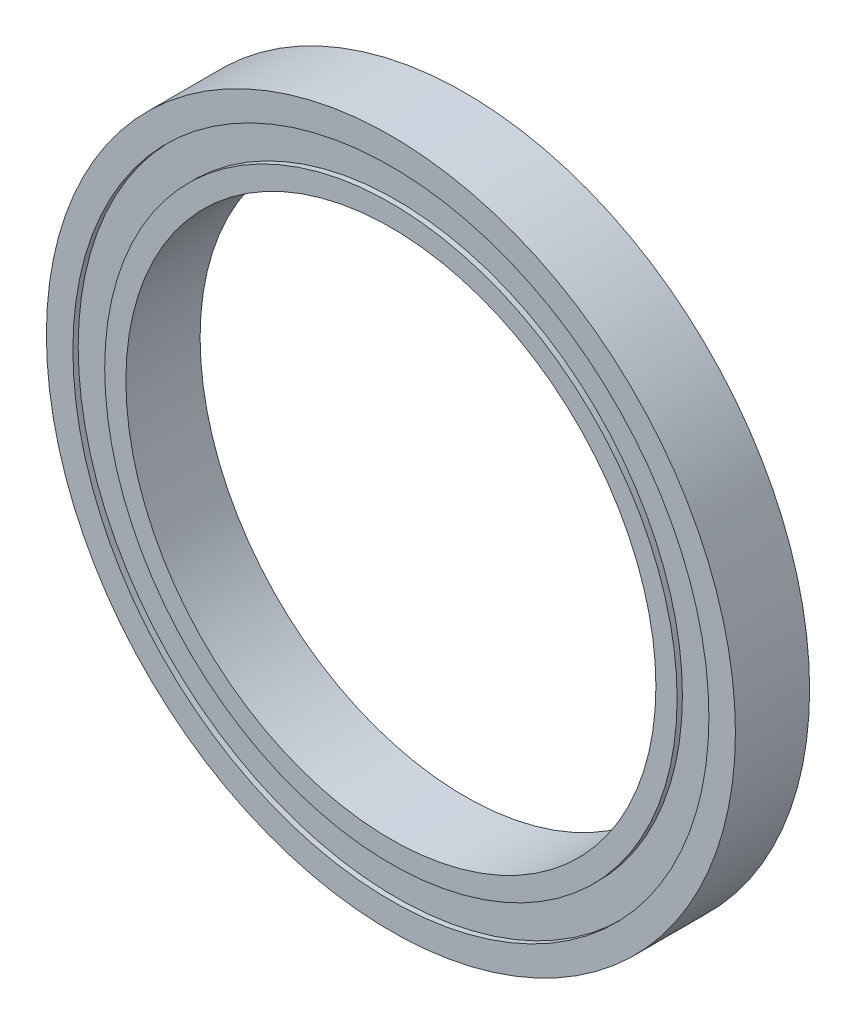
ISO-10303-21;
HEADER;
FILE_DESCRIPTION(('STEP AP214'),'2;1');
FILE_NAME('part.step','',(''),(''),'','','');
FILE_SCHEMA(('AUTOMOTIVE_DESIGN { 1 0 10303 214 1 1 1 1 }'));
ENDSEC;
DATA;
#1=APPLICATION_CONTEXT('core data for automotive mechanical design processes');
#2=APPLICATION_PROTOCOL_DEFINITION('international standard','automotive_design',2000,#1);
#3=PRODUCT_CONTEXT('',#1,'mechanical');
#4=PRODUCT('Part','Part','',(#3));
#5=PRODUCT_RELATED_PRODUCT_CATEGORY('part','',(#4));
#6=PRODUCT_DEFINITION_FORMATION('','',#4);
#7=PRODUCT_DEFINITION_CONTEXT('part definition',#1,'design');
#8=PRODUCT_DEFINITION('design','',#6,#7);
#9=PRODUCT_DEFINITION_SHAPE('','',#8);
#10=(LENGTH_UNIT() NAMED_UNIT(*) SI_UNIT(.MILLI.,.METRE.));
#11=(NAMED_UNIT(*) PLANE_ANGLE_UNIT() SI_UNIT($,.RADIAN.));
#12=(NAMED_UNIT(*) SI_UNIT($,.STERADIAN.) SOLID_ANGLE_UNIT());
#13=UNCERTAINTY_MEASURE_WITH_UNIT(LENGTH_MEASURE(1.E-05),#10,'distance_accuracy_value','');
#14=(GEOMETRIC_REPRESENTATION_CONTEXT(3) GLOBAL_UNCERTAINTY_ASSIGNED_CONTEXT((#13)) GLOBAL_UNIT_ASSIGNED_CONTEXT((#10,
#11,#12)) REPRESENTATION_CONTEXT('',''));
#15=CARTESIAN_POINT('',(0.,0.,0.));
#16=DIRECTION('',(0.,0.,1.));
#17=DIRECTION('',(1.,0.,0.));
#18=AXIS2_PLACEMENT_3D('',#15,#16,#17);
#19=CARTESIAN_POINT('',(0.,0.,-3.5));
#20=DIRECTION('',(0.,0.,1.));
#21=DIRECTION('',(1.,0.,0.));
#22=AXIS2_PLACEMENT_3D('',#19,#20,#21);
#23=PLANE('',#22);
#24=CARTESIAN_POINT('',(0.,0.,-3.5));
#25=DIRECTION('',(0.,0.,1.));
#26=DIRECTION('',(1.,0.,0.));
#27=AXIS2_PLACEMENT_3D('',#24,#25,#26);
#28=CIRCLE('',#27,25.);
#29=CARTESIAN_POINT('',(25.,0.,-3.5));
#30=VERTEX_POINT('',#29);
#31=EDGE_CURVE('E55',#30,#30,#28,.T.);
#32=ORIENTED_EDGE('',*,*,#31,.T.);
#33=EDGE_LOOP('',(#32));
#34=FACE_BOUND('',#33,.T.);
#35=CARTESIAN_POINT('',(0.,0.,-3.5));
#36=DIRECTION('',(0.,0.,1.));
#37=DIRECTION('',(1.,0.,0.));
#38=AXIS2_PLACEMENT_3D('',#35,#36,#37);
#39=CIRCLE('',#38,27.);
#40=CARTESIAN_POINT('',(27.,0.,-3.5));
#41=VERTEX_POINT('',#40);
#42=EDGE_CURVE('E78',#41,#41,#39,.T.);
#43=ORIENTED_EDGE('',*,*,#42,.F.);
#44=EDGE_LOOP('',(#43));
#45=FACE_BOUND('',#44,.T.);
#46=ADVANCED_FACE('F39',(#34,#45),#23,.F.);
#47=CARTESIAN_POINT('',(0.,0.,3.5));
#48=DIRECTION('',(0.,0.,1.));
#49=DIRECTION('',(1.,0.,0.));
#50=AXIS2_PLACEMENT_3D('',#47,#48,#49);
#51=PLANE('',#50);
#52=CARTESIAN_POINT('',(0.,0.,3.5));
#53=DIRECTION('',(0.,0.,1.));
#54=DIRECTION('',(1.,0.,0.));
#55=AXIS2_PLACEMENT_3D('',#52,#53,#54);
#56=CIRCLE('',#55,25.);
#57=CARTESIAN_POINT('',(25.,0.,3.5));
#58=VERTEX_POINT('',#57);
#59=EDGE_CURVE('E49',#58,#58,#56,.T.);
#60=ORIENTED_EDGE('',*,*,#59,.F.);
#61=EDGE_LOOP('',(#60));
#62=FACE_BOUND('',#61,.T.);
#63=CARTESIAN_POINT('',(0.,0.,3.5));
#64=DIRECTION('',(0.,0.,1.));
#65=DIRECTION('',(1.,0.,0.));
#66=AXIS2_PLACEMENT_3D('',#63,#64,#65);
#67=CIRCLE('',#66,27.);
#68=CARTESIAN_POINT('',(27.,0.,3.5));
#69=VERTEX_POINT('',#68);
#70=EDGE_CURVE('E64',#69,#69,#67,.T.);
#71=ORIENTED_EDGE('',*,*,#70,.T.);
#72=EDGE_LOOP('',(#71));
#73=FACE_BOUND('',#72,.T.);
#74=ADVANCED_FACE('F95',(#62,#73),#51,.T.);
#75=CARTESIAN_POINT('',(0.,0.,3.5));
#76=DIRECTION('',(0.,0.,1.));
#77=DIRECTION('',(1.,0.,0.));
#78=AXIS2_PLACEMENT_3D('',#75,#76,#77);
#79=CIRCLE('',#78,30.);
#80=CARTESIAN_POINT('',(30.,0.,3.5));
#81=VERTEX_POINT('',#80);
#82=EDGE_CURVE('E59',#81,#81,#79,.T.);
#83=ORIENTED_EDGE('',*,*,#82,.F.);
#84=EDGE_LOOP('',(#83));
#85=FACE_BOUND('',#84,.T.);
#86=CARTESIAN_POINT('',(0.,0.,3.5));
#87=DIRECTION('',(0.,0.,1.));
#88=DIRECTION('',(1.,0.,0.));
#89=AXIS2_PLACEMENT_3D('',#86,#87,#88);
#90=CIRCLE('',#89,32.5);
#91=CARTESIAN_POINT('',(32.5,0.,3.5));
#92=VERTEX_POINT('',#91);
#93=EDGE_CURVE('E10',#92,#92,#90,.T.);
#94=ORIENTED_EDGE('',*,*,#93,.T.);
#95=EDGE_LOOP('',(#94));
#96=FACE_BOUND('',#95,.T.);
#97=ADVANCED_FACE('F99',(#85,#96),#51,.T.);
#98=CARTESIAN_POINT('',(0.,0.,-3.5));
#99=DIRECTION('',(0.,0.,1.));
#100=DIRECTION('',(1.,0.,0.));
#101=AXIS2_PLACEMENT_3D('',#98,#99,#100);
#102=CIRCLE('',#101,30.);
#103=CARTESIAN_POINT('',(30.,0.,-3.5));
#104=VERTEX_POINT('',#103);
#105=EDGE_CURVE('E70',#104,#104,#102,.T.);
#106=ORIENTED_EDGE('',*,*,#105,.T.);
#107=EDGE_LOOP('',(#106));
#108=FACE_BOUND('',#107,.T.);
#109=CARTESIAN_POINT('',(0.,0.,-3.5));
#110=DIRECTION('',(0.,0.,1.));
#111=DIRECTION('',(1.,0.,0.));
#112=AXIS2_PLACEMENT_3D('',#109,#110,#111);
#113=CIRCLE('',#112,32.5);
#114=CARTESIAN_POINT('',(32.5,0.,-3.5));
#115=VERTEX_POINT('',#114);
#116=EDGE_CURVE('E43',#115,#115,#113,.T.);
#117=ORIENTED_EDGE('',*,*,#116,.F.);
#118=EDGE_LOOP('',(#117));
#119=FACE_BOUND('',#118,.T.);
#120=ADVANCED_FACE('F94',(#108,#119),#23,.F.);
#121=CARTESIAN_POINT('',(0.,0.,3.5));
#122=DIRECTION('',(0.,0.,-1.));
#123=DIRECTION('',(-1.,0.,0.));
#124=AXIS2_PLACEMENT_3D('',#121,#122,#123);
#125=CYLINDRICAL_SURFACE('',#124,32.5);
#126=ORIENTED_EDGE('',*,*,#93,.F.);
#127=EDGE_LOOP('',(#126));
#128=FACE_BOUND('',#127,.T.);
#129=ORIENTED_EDGE('',*,*,#116,.T.);
#130=EDGE_LOOP('',(#129));
#131=FACE_BOUND('',#130,.T.);
#132=ADVANCED_FACE('F41',(#128,#131),#125,.T.);
#133=CARTESIAN_POINT('',(0.,0.,3.5));
#134=DIRECTION('',(0.,0.,-1.));
#135=DIRECTION('',(-1.,0.,0.));
#136=AXIS2_PLACEMENT_3D('',#133,#134,#135);
#137=CYLINDRICAL_SURFACE('',#136,25.);
#138=ORIENTED_EDGE('',*,*,#59,.T.);
#139=EDGE_LOOP('',(#138));
#140=FACE_BOUND('',#139,.T.);
#141=ORIENTED_EDGE('',*,*,#31,.F.);
#142=EDGE_LOOP('',(#141));
#143=FACE_BOUND('',#142,.T.);
#144=ADVANCED_FACE('F107',(#140,#143),#137,.F.);
#145=CARTESIAN_POINT('',(0.,0.,3.));
#146=DIRECTION('',(0.,0.,1.));
#147=DIRECTION('',(1.,0.,0.));
#148=AXIS2_PLACEMENT_3D('',#145,#146,#147);
#149=CYLINDRICAL_SURFACE('',#148,30.);
#150=CARTESIAN_POINT('',(0.,0.,3.));
#151=DIRECTION('',(0.,0.,1.));
#152=DIRECTION('',(1.,0.,0.));
#153=AXIS2_PLACEMENT_3D('',#150,#151,#152);
#154=CIRCLE('',#153,30.);
#155=CARTESIAN_POINT('',(30.,0.,3.));
#156=VERTEX_POINT('',#155);
#157=EDGE_CURVE('E54',#156,#156,#154,.T.);
#158=ORIENTED_EDGE('',*,*,#157,.F.);
#159=EDGE_LOOP('',(#158));
#160=FACE_BOUND('',#159,.T.);
#161=ORIENTED_EDGE('',*,*,#82,.T.);
#162=EDGE_LOOP('',(#161));
#163=FACE_BOUND('',#162,.T.);
#164=ADVANCED_FACE('F133',(#160,#163),#149,.F.);
#165=CARTESIAN_POINT('',(0.,0.,3.));
#166=DIRECTION('',(0.,0.,1.));
#167=DIRECTION('',(1.,0.,0.));
#168=AXIS2_PLACEMENT_3D('',#165,#166,#167);
#169=PLANE('',#168);
#170=CARTESIAN_POINT('',(0.,0.,3.));
#171=DIRECTION('',(0.,0.,1.));
#172=DIRECTION('',(1.,0.,0.));
#173=AXIS2_PLACEMENT_3D('',#170,#171,#172);
#174=CIRCLE('',#173,27.);
#175=CARTESIAN_POINT('',(27.,0.,3.));
#176=VERTEX_POINT('',#175);
#177=EDGE_CURVE('E63',#176,#176,#174,.T.);
#178=ORIENTED_EDGE('',*,*,#177,.F.);
#179=EDGE_LOOP('',(#178));
#180=FACE_BOUND('',#179,.T.);
#181=ORIENTED_EDGE('',*,*,#157,.T.);
#182=EDGE_LOOP('',(#181));
#183=FACE_BOUND('',#182,.T.);
#184=ADVANCED_FACE('F130',(#180,#183),#169,.T.);
#185=CARTESIAN_POINT('',(0.,0.,3.));
#186=DIRECTION('',(0.,0.,1.));
#187=DIRECTION('',(1.,0.,0.));
#188=AXIS2_PLACEMENT_3D('',#185,#186,#187);
#189=CYLINDRICAL_SURFACE('',#188,27.);
#190=ORIENTED_EDGE('',*,*,#177,.T.);
#191=EDGE_LOOP('',(#190));
#192=FACE_BOUND('',#191,.T.);
#193=ORIENTED_EDGE('',*,*,#70,.F.);
#194=EDGE_LOOP('',(#193));
#195=FACE_BOUND('',#194,.T.);
#196=ADVANCED_FACE('F122',(#192,#195),#189,.T.);
#197=CARTESIAN_POINT('',(0.,0.,-3.));
#198=DIRECTION('',(0.,0.,-1.));
#199=DIRECTION('',(1.,0.,0.));
#200=AXIS2_PLACEMENT_3D('',#197,#198,#199);
#201=PLANE('',#200);
#202=CARTESIAN_POINT('',(0.,0.,-3.));
#203=DIRECTION('',(0.,0.,1.));
#204=DIRECTION('',(1.,0.,0.));
#205=AXIS2_PLACEMENT_3D('',#202,#203,#204);
#206=CIRCLE('',#205,30.);
#207=CARTESIAN_POINT('',(30.,0.,-3.));
#208=VERTEX_POINT('',#207);
#209=EDGE_CURVE('E67',#208,#208,#206,.T.);
#210=ORIENTED_EDGE('',*,*,#209,.F.);
#211=EDGE_LOOP('',(#210));
#212=FACE_BOUND('',#211,.T.);
#213=CARTESIAN_POINT('',(0.,0.,-3.));
#214=DIRECTION('',(0.,0.,1.));
#215=DIRECTION('',(1.,0.,0.));
#216=AXIS2_PLACEMENT_3D('',#213,#214,#215);
#217=CIRCLE('',#216,27.);
#218=CARTESIAN_POINT('',(27.,0.,-3.));
#219=VERTEX_POINT('',#218);
#220=EDGE_CURVE('E71',#219,#219,#217,.T.);
#221=ORIENTED_EDGE('',*,*,#220,.T.);
#222=EDGE_LOOP('',(#221));
#223=FACE_BOUND('',#222,.T.);
#224=ADVANCED_FACE('F82',(#212,#223),#201,.T.);
#225=CARTESIAN_POINT('',(0.,0.,-3.));
#226=DIRECTION('',(0.,0.,-1.));
#227=DIRECTION('',(-1.,0.,0.));
#228=AXIS2_PLACEMENT_3D('',#225,#226,#227);
#229=CYLINDRICAL_SURFACE('',#228,30.);
#230=ORIENTED_EDGE('',*,*,#209,.T.);
#231=EDGE_LOOP('',(#230));
#232=FACE_BOUND('',#231,.T.);
#233=ORIENTED_EDGE('',*,*,#105,.F.);
#234=EDGE_LOOP('',(#233));
#235=FACE_BOUND('',#234,.T.);
#236=ADVANCED_FACE('F87',(#232,#235),#229,.F.);
#237=CARTESIAN_POINT('',(0.,0.,-3.));
#238=DIRECTION('',(0.,0.,-1.));
#239=DIRECTION('',(-1.,0.,0.));
#240=AXIS2_PLACEMENT_3D('',#237,#238,#239);
#241=CYLINDRICAL_SURFACE('',#240,27.);
#242=ORIENTED_EDGE('',*,*,#220,.F.);
#243=EDGE_LOOP('',(#242));
#244=FACE_BOUND('',#243,.T.);
#245=ORIENTED_EDGE('',*,*,#42,.T.);
#246=EDGE_LOOP('',(#245));
#247=FACE_BOUND('',#246,.T.);
#248=ADVANCED_FACE('F83',(#244,#247),#241,.T.);
#249=CLOSED_SHELL('',(#46,#74,#97,#120,#132,#144,#164,#184,#196,#224,#236,#248));
#250=MANIFOLD_SOLID_BREP('B2',#249);
#251=ADVANCED_BREP_SHAPE_REPRESENTATION('',(#18,#250),#14);
#252=SHAPE_DEFINITION_REPRESENTATION(#9,#251);
ENDSEC;
END-ISO-10303-21;
